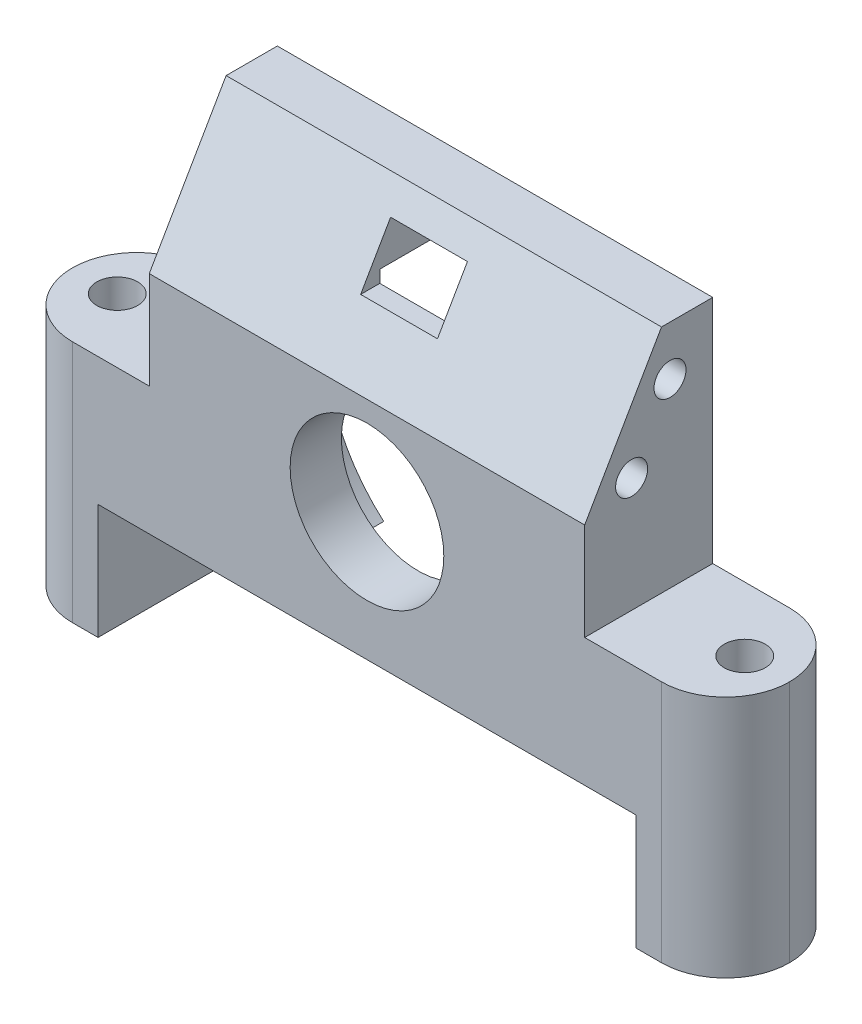
ISO-10303-21;
HEADER;
FILE_DESCRIPTION(('STEP AP214'),'2;1');
FILE_NAME('part.step','',(''),(''),'','','');
FILE_SCHEMA(('AUTOMOTIVE_DESIGN { 1 0 10303 214 1 1 1 1 }'));
ENDSEC;
DATA;
#1=APPLICATION_CONTEXT('core data for automotive mechanical design processes');
#2=APPLICATION_PROTOCOL_DEFINITION('international standard','automotive_design',2000,#1);
#3=PRODUCT_CONTEXT('',#1,'mechanical');
#4=PRODUCT('Part','Part','',(#3));
#5=PRODUCT_RELATED_PRODUCT_CATEGORY('part','',(#4));
#6=PRODUCT_DEFINITION_FORMATION('','',#4);
#7=PRODUCT_DEFINITION_CONTEXT('part definition',#1,'design');
#8=PRODUCT_DEFINITION('design','',#6,#7);
#9=PRODUCT_DEFINITION_SHAPE('','',#8);
#10=(LENGTH_UNIT() NAMED_UNIT(*) SI_UNIT(.MILLI.,.METRE.));
#11=(NAMED_UNIT(*) PLANE_ANGLE_UNIT() SI_UNIT($,.RADIAN.));
#12=(NAMED_UNIT(*) SI_UNIT($,.STERADIAN.) SOLID_ANGLE_UNIT());
#13=UNCERTAINTY_MEASURE_WITH_UNIT(LENGTH_MEASURE(1.E-05),#10,'distance_accuracy_value','');
#14=(GEOMETRIC_REPRESENTATION_CONTEXT(3) GLOBAL_UNCERTAINTY_ASSIGNED_CONTEXT((#13)) GLOBAL_UNIT_ASSIGNED_CONTEXT((#10,
#11,#12)) REPRESENTATION_CONTEXT('',''));
#15=CARTESIAN_POINT('',(0.,0.,0.));
#16=DIRECTION('',(0.,0.,1.));
#17=DIRECTION('',(1.,0.,0.));
#18=AXIS2_PLACEMENT_3D('',#15,#16,#17);
#19=CARTESIAN_POINT('',(0.,0.,6.));
#20=DIRECTION('',(0.,0.,-1.));
#21=DIRECTION('',(-1.,0.,0.));
#22=AXIS2_PLACEMENT_3D('',#19,#20,#21);
#23=CYLINDRICAL_SURFACE('',#22,13.25);
#24=CARTESIAN_POINT('',(0.,0.,6.));
#25=DIRECTION('',(0.,0.,-1.));
#26=DIRECTION('',(-1.,0.,0.));
#27=AXIS2_PLACEMENT_3D('',#24,#25,#26);
#28=CIRCLE('',#27,13.25);
#29=CARTESIAN_POINT('',(3.,12.9059094991403,6.));
#30=VERTEX_POINT('',#29);
#31=CARTESIAN_POINT('',(8.69266932535685,-10.,6.));
#32=VERTEX_POINT('',#31);
#33=EDGE_CURVE('E324',#30,#32,#28,.T.);
#34=ORIENTED_EDGE('',*,*,#33,.F.);
#35=DIRECTION('',(0.,0.,-1.));
#36=VECTOR('',#35,1.);
#37=CARTESIAN_POINT('',(3.,12.9059094991403,6.));
#38=LINE('',#37,#36);
#39=CARTESIAN_POINT('',(3.,12.9059094991403,0.));
#40=VERTEX_POINT('',#39);
#41=EDGE_CURVE('E238',#30,#40,#38,.T.);
#42=ORIENTED_EDGE('',*,*,#41,.T.);
#43=CARTESIAN_POINT('',(0.,0.,0.));
#44=DIRECTION('',(0.,0.,-1.));
#45=DIRECTION('',(-1.,0.,0.));
#46=AXIS2_PLACEMENT_3D('',#43,#44,#45);
#47=CIRCLE('',#46,13.25);
#48=CARTESIAN_POINT('',(8.69266932535685,-10.,0.));
#49=VERTEX_POINT('',#48);
#50=EDGE_CURVE('E319',#40,#49,#47,.T.);
#51=ORIENTED_EDGE('',*,*,#50,.T.);
#52=DIRECTION('',(0.,0.,-1.));
#53=VECTOR('',#52,1.);
#54=CARTESIAN_POINT('',(8.69266932535685,-10.,6.));
#55=LINE('',#54,#53);
#56=EDGE_CURVE('E376',#32,#49,#55,.T.);
#57=ORIENTED_EDGE('',*,*,#56,.F.);
#58=EDGE_LOOP('',(#34,#42,#51,#57));
#59=FACE_BOUND('',#58,.T.);
#60=ADVANCED_FACE('F36',(#59),#23,.F.);
#61=CARTESIAN_POINT('',(17.,18.,10.));
#62=DIRECTION('',(-1.,0.,0.));
#63=DIRECTION('',(0.,0.,1.));
#64=AXIS2_PLACEMENT_3D('',#61,#62,#63);
#65=PLANE('',#64);
#66=CARTESIAN_POINT('',(17.,14.15,3.33604719043193));
#67=DIRECTION('',(-1.,0.,0.));
#68=DIRECTION('',(0.,0.,1.));
#69=AXIS2_PLACEMENT_3D('',#66,#67,#68);
#70=CIRCLE('',#69,1.25);
#71=CARTESIAN_POINT('',(17.,14.15,4.58604719043193));
#72=VERTEX_POINT('',#71);
#73=EDGE_CURVE('E256',#72,#72,#70,.T.);
#74=ORIENTED_EDGE('',*,*,#73,.T.);
#75=EDGE_LOOP('',(#74));
#76=FACE_BOUND('',#75,.T.);
#77=DIRECTION('',(0.,0.,-1.));
#78=VECTOR('',#77,1.);
#79=CARTESIAN_POINT('',(17.,18.,10.));
#80=LINE('',#79,#78);
#81=CARTESIAN_POINT('',(17.,18.,3.99999999999999));
#82=VERTEX_POINT('',#81);
#83=CARTESIAN_POINT('',(17.,18.,0.));
#84=VERTEX_POINT('',#83);
#85=EDGE_CURVE('E363',#82,#84,#80,.T.);
#86=ORIENTED_EDGE('',*,*,#85,.F.);
#87=DIRECTION('',(0.,0.866025403784438,-0.500000000000001));
#88=VECTOR('',#87,1.);
#89=CARTESIAN_POINT('',(17.,7.60769515458674,10.));
#90=LINE('',#89,#88);
#91=CARTESIAN_POINT('',(17.,7.60769515458674,10.));
#92=VERTEX_POINT('',#91);
#93=EDGE_CURVE('E417',#82,#92,#90,.F.);
#94=ORIENTED_EDGE('',*,*,#93,.T.);
#95=DIRECTION('',(0.,1.,0.));
#96=VECTOR('',#95,1.);
#97=CARTESIAN_POINT('',(17.,18.,10.));
#98=LINE('',#97,#96);
#99=CARTESIAN_POINT('',(17.,0.,10.));
#100=VERTEX_POINT('',#99);
#101=EDGE_CURVE('E343',#100,#92,#98,.T.);
#102=ORIENTED_EDGE('',*,*,#101,.F.);
#103=DIRECTION('',(0.,0.,-1.));
#104=VECTOR('',#103,1.);
#105=CARTESIAN_POINT('',(17.,0.,10.));
#106=LINE('',#105,#104);
#107=CARTESIAN_POINT('',(17.,0.,0.));
#108=VERTEX_POINT('',#107);
#109=EDGE_CURVE('E365',#100,#108,#106,.T.);
#110=ORIENTED_EDGE('',*,*,#109,.T.);
#111=DIRECTION('',(0.,1.,0.));
#112=VECTOR('',#111,1.);
#113=CARTESIAN_POINT('',(17.,18.,0.));
#114=LINE('',#113,#112);
#115=EDGE_CURVE('E357',#108,#84,#114,.T.);
#116=ORIENTED_EDGE('',*,*,#115,.T.);
#117=EDGE_LOOP('',(#86,#94,#102,#110,#116));
#118=FACE_BOUND('',#117,.T.);
#119=CARTESIAN_POINT('',(17.,8.96,6.33249508752608));
#120=DIRECTION('',(-1.,0.,0.));
#121=DIRECTION('',(0.,0.,1.));
#122=AXIS2_PLACEMENT_3D('',#119,#120,#121);
#123=CIRCLE('',#122,1.25);
#124=CARTESIAN_POINT('',(17.,8.96,7.58249508752608));
#125=VERTEX_POINT('',#124);
#126=EDGE_CURVE('E253',#125,#125,#123,.T.);
#127=ORIENTED_EDGE('',*,*,#126,.T.);
#128=EDGE_LOOP('',(#127));
#129=FACE_BOUND('',#128,.T.);
#130=ADVANCED_FACE('F480',(#76,#118,#129),#65,.F.);
#131=CARTESIAN_POINT('',(0.,6.53295697895827E-07,10.));
#132=DIRECTION('',(0.,0.,-1.));
#133=DIRECTION('',(-1.,0.,0.));
#134=AXIS2_PLACEMENT_3D('',#131,#132,#133);
#135=CYLINDRICAL_SURFACE('',#134,6.);
#136=CARTESIAN_POINT('',(0.,6.53295697895827E-07,10.));
#137=DIRECTION('',(0.,0.,1.));
#138=DIRECTION('',(1.,0.,0.));
#139=AXIS2_PLACEMENT_3D('',#136,#137,#138);
#140=CIRCLE('',#139,6.);
#141=CARTESIAN_POINT('',(5.99999999999999,6.53295697895827E-07,10.));
#142=VERTEX_POINT('',#141);
#143=EDGE_CURVE('E329',#142,#142,#140,.T.);
#144=ORIENTED_EDGE('',*,*,#143,.T.);
#145=EDGE_LOOP('',(#144));
#146=FACE_BOUND('',#145,.T.);
#147=CARTESIAN_POINT('',(0.,6.53295697895827E-07,6.));
#148=DIRECTION('',(0.,0.,-1.));
#149=DIRECTION('',(-1.,0.,0.));
#150=AXIS2_PLACEMENT_3D('',#147,#148,#149);
#151=CIRCLE('',#150,6.);
#152=CARTESIAN_POINT('',(-6.00000000000001,6.53295697895827E-07,6.));
#153=VERTEX_POINT('',#152);
#154=EDGE_CURVE('E323',#153,#153,#151,.T.);
#155=ORIENTED_EDGE('',*,*,#154,.T.);
#156=EDGE_LOOP('',(#155));
#157=FACE_BOUND('',#156,.T.);
#158=ADVANCED_FACE('F511',(#146,#157),#135,.F.);
#159=CARTESIAN_POINT('',(-17.,18.,10.));
#160=DIRECTION('',(0.,0.,-1.));
#161=DIRECTION('',(-1.,0.,0.));
#162=AXIS2_PLACEMENT_3D('',#159,#160,#161);
#163=PLANE('',#162);
#164=ORIENTED_EDGE('',*,*,#101,.T.);
#165=DIRECTION('',(-1.,0.,0.));
#166=VECTOR('',#165,1.);
#167=CARTESIAN_POINT('',(-17.,7.60769515458674,10.));
#168=LINE('',#167,#166);
#169=CARTESIAN_POINT('',(-17.,7.60769515458675,10.));
#170=VERTEX_POINT('',#169);
#171=EDGE_CURVE('E405',#92,#170,#168,.T.);
#172=ORIENTED_EDGE('',*,*,#171,.T.);
#173=DIRECTION('',(0.,-1.,0.));
#174=VECTOR('',#173,1.);
#175=CARTESIAN_POINT('',(-17.,0.,10.));
#176=LINE('',#175,#174);
#177=CARTESIAN_POINT('',(-17.,0.,10.));
#178=VERTEX_POINT('',#177);
#179=EDGE_CURVE('E333',#170,#178,#176,.T.);
#180=ORIENTED_EDGE('',*,*,#179,.T.);
#181=DIRECTION('',(-1.,0.,0.));
#182=VECTOR('',#181,1.);
#183=CARTESIAN_POINT('',(-17.,0.,10.));
#184=LINE('',#183,#182);
#185=CARTESIAN_POINT('',(-23.,0.,10.));
#186=VERTEX_POINT('',#185);
#187=EDGE_CURVE('E335',#178,#186,#184,.T.);
#188=ORIENTED_EDGE('',*,*,#187,.T.);
#189=DIRECTION('',(0.,-1.,0.));
#190=VECTOR('',#189,1.);
#191=CARTESIAN_POINT('',(-23.,18.,10.));
#192=LINE('',#191,#190);
#193=CARTESIAN_POINT('',(-23.,-19.,10.));
#194=VERTEX_POINT('',#193);
#195=EDGE_CURVE('E379',#186,#194,#192,.T.);
#196=ORIENTED_EDGE('',*,*,#195,.T.);
#197=DIRECTION('',(1.,0.,0.));
#198=VECTOR('',#197,1.);
#199=CARTESIAN_POINT('',(0.,-19.,10.));
#200=LINE('',#199,#198);
#201=CARTESIAN_POINT('',(-21.,-19.,10.));
#202=VERTEX_POINT('',#201);
#203=EDGE_CURVE('E282',#194,#202,#200,.T.);
#204=ORIENTED_EDGE('',*,*,#203,.T.);
#205=DIRECTION('',(0.,1.,0.));
#206=VECTOR('',#205,1.);
#207=CARTESIAN_POINT('',(-21.,-19.,10.));
#208=LINE('',#207,#206);
#209=CARTESIAN_POINT('',(-21.,-10.,10.));
#210=VERTEX_POINT('',#209);
#211=EDGE_CURVE('E293',#202,#210,#208,.T.);
#212=ORIENTED_EDGE('',*,*,#211,.T.);
#213=DIRECTION('',(1.,0.,0.));
#214=VECTOR('',#213,1.);
#215=CARTESIAN_POINT('',(-28.,-10.,10.));
#216=LINE('',#215,#214);
#217=CARTESIAN_POINT('',(21.,-10.,10.));
#218=VERTEX_POINT('',#217);
#219=EDGE_CURVE('E339',#210,#218,#216,.T.);
#220=ORIENTED_EDGE('',*,*,#219,.T.);
#221=DIRECTION('',(0.,1.,0.));
#222=VECTOR('',#221,1.);
#223=CARTESIAN_POINT('',(21.,-19.,10.));
#224=LINE('',#223,#222);
#225=CARTESIAN_POINT('',(21.,-19.,10.));
#226=VERTEX_POINT('',#225);
#227=EDGE_CURVE('E306',#226,#218,#224,.T.);
#228=ORIENTED_EDGE('',*,*,#227,.F.);
#229=DIRECTION('',(1.,0.,0.));
#230=VECTOR('',#229,1.);
#231=CARTESIAN_POINT('',(0.,-19.,10.));
#232=LINE('',#231,#230);
#233=CARTESIAN_POINT('',(23.,-19.,10.));
#234=VERTEX_POINT('',#233);
#235=EDGE_CURVE('E303',#226,#234,#232,.T.);
#236=ORIENTED_EDGE('',*,*,#235,.T.);
#237=DIRECTION('',(0.,1.,0.));
#238=VECTOR('',#237,1.);
#239=CARTESIAN_POINT('',(23.,18.,10.));
#240=LINE('',#239,#238);
#241=CARTESIAN_POINT('',(23.,0.,10.));
#242=VERTEX_POINT('',#241);
#243=EDGE_CURVE('E382',#234,#242,#240,.T.);
#244=ORIENTED_EDGE('',*,*,#243,.T.);
#245=DIRECTION('',(-1.,0.,0.));
#246=VECTOR('',#245,1.);
#247=CARTESIAN_POINT('',(17.,0.,10.));
#248=LINE('',#247,#246);
#249=EDGE_CURVE('E341',#242,#100,#248,.T.);
#250=ORIENTED_EDGE('',*,*,#249,.T.);
#251=EDGE_LOOP('',(#164,#172,#180,#188,#196,#204,#212,#220,#228,#236,#244,#250));
#252=FACE_BOUND('',#251,.T.);
#253=ORIENTED_EDGE('',*,*,#143,.F.);
#254=EDGE_LOOP('',(#253));
#255=FACE_BOUND('',#254,.T.);
#256=ADVANCED_FACE('F850',(#252,#255),#163,.F.);
#257=CARTESIAN_POINT('',(-17.,18.,0.));
#258=DIRECTION('',(0.,0.,-1.));
#259=DIRECTION('',(-1.,0.,0.));
#260=AXIS2_PLACEMENT_3D('',#257,#258,#259);
#261=PLANE('',#260);
#262=DIRECTION('',(0.,-1.,0.));
#263=VECTOR('',#262,1.);
#264=CARTESIAN_POINT('',(3.,16.,0.));
#265=LINE('',#264,#263);
#266=CARTESIAN_POINT('',(3.,16.,0.));
#267=VERTEX_POINT('',#266);
#268=EDGE_CURVE('E213',#267,#40,#265,.T.);
#269=ORIENTED_EDGE('',*,*,#268,.F.);
#270=DIRECTION('',(1.,0.,0.));
#271=VECTOR('',#270,1.);
#272=CARTESIAN_POINT('',(3.,16.,0.));
#273=LINE('',#272,#271);
#274=CARTESIAN_POINT('',(-3.,16.,0.));
#275=VERTEX_POINT('',#274);
#276=EDGE_CURVE('E212',#275,#267,#273,.T.);
#277=ORIENTED_EDGE('',*,*,#276,.F.);
#278=DIRECTION('',(0.,1.,0.));
#279=VECTOR('',#278,1.);
#280=CARTESIAN_POINT('',(-3.,16.,0.));
#281=LINE('',#280,#279);
#282=CARTESIAN_POINT('',(-3.,12.9059094991403,0.));
#283=VERTEX_POINT('',#282);
#284=EDGE_CURVE('E201',#283,#275,#281,.T.);
#285=ORIENTED_EDGE('',*,*,#284,.F.);
#286=CARTESIAN_POINT('',(-8.69266932535685,-10.,0.));
#287=VERTEX_POINT('',#286);
#288=EDGE_CURVE('E325',#287,#283,#47,.T.);
#289=ORIENTED_EDGE('',*,*,#288,.F.);
#290=DIRECTION('',(1.,0.,0.));
#291=VECTOR('',#290,1.);
#292=CARTESIAN_POINT('',(-28.,-10.,0.));
#293=LINE('',#292,#291);
#294=CARTESIAN_POINT('',(-21.,-10.,0.));
#295=VERTEX_POINT('',#294);
#296=EDGE_CURVE('E353',#295,#287,#293,.T.);
#297=ORIENTED_EDGE('',*,*,#296,.F.);
#298=DIRECTION('',(0.,1.,0.));
#299=VECTOR('',#298,1.);
#300=CARTESIAN_POINT('',(-21.,-19.,0.));
#301=LINE('',#300,#299);
#302=CARTESIAN_POINT('',(-21.,-19.,0.));
#303=VERTEX_POINT('',#302);
#304=EDGE_CURVE('E287',#303,#295,#301,.T.);
#305=ORIENTED_EDGE('',*,*,#304,.F.);
#306=DIRECTION('',(1.,0.,0.));
#307=VECTOR('',#306,1.);
#308=CARTESIAN_POINT('',(0.,-19.,0.));
#309=LINE('',#308,#307);
#310=CARTESIAN_POINT('',(-23.,-19.,0.));
#311=VERTEX_POINT('',#310);
#312=EDGE_CURVE('E285',#311,#303,#309,.T.);
#313=ORIENTED_EDGE('',*,*,#312,.F.);
#314=DIRECTION('',(0.,-1.,0.));
#315=VECTOR('',#314,1.);
#316=CARTESIAN_POINT('',(-23.,0.,0.));
#317=LINE('',#316,#315);
#318=CARTESIAN_POINT('',(-23.,0.,0.));
#319=VERTEX_POINT('',#318);
#320=EDGE_CURVE('E393',#311,#319,#317,.F.);
#321=ORIENTED_EDGE('',*,*,#320,.T.);
#322=DIRECTION('',(-1.,0.,0.));
#323=VECTOR('',#322,1.);
#324=CARTESIAN_POINT('',(-17.,0.,0.));
#325=LINE('',#324,#323);
#326=CARTESIAN_POINT('',(-17.,0.,0.));
#327=VERTEX_POINT('',#326);
#328=EDGE_CURVE('E349',#327,#319,#325,.T.);
#329=ORIENTED_EDGE('',*,*,#328,.F.);
#330=DIRECTION('',(0.,-1.,0.));
#331=VECTOR('',#330,1.);
#332=CARTESIAN_POINT('',(-17.,0.,0.));
#333=LINE('',#332,#331);
#334=CARTESIAN_POINT('',(-17.,18.,0.));
#335=VERTEX_POINT('',#334);
#336=EDGE_CURVE('E332',#335,#327,#333,.T.);
#337=ORIENTED_EDGE('',*,*,#336,.F.);
#338=DIRECTION('',(-1.,0.,0.));
#339=VECTOR('',#338,1.);
#340=CARTESIAN_POINT('',(-17.,18.,0.));
#341=LINE('',#340,#339);
#342=EDGE_CURVE('E336',#84,#335,#341,.T.);
#343=ORIENTED_EDGE('',*,*,#342,.F.);
#344=ORIENTED_EDGE('',*,*,#115,.F.);
#345=DIRECTION('',(-1.,0.,0.));
#346=VECTOR('',#345,1.);
#347=CARTESIAN_POINT('',(17.,0.,0.));
#348=LINE('',#347,#346);
#349=CARTESIAN_POINT('',(23.,0.,0.));
#350=VERTEX_POINT('',#349);
#351=EDGE_CURVE('E355',#350,#108,#348,.T.);
#352=ORIENTED_EDGE('',*,*,#351,.F.);
#353=DIRECTION('',(0.,1.,0.));
#354=VECTOR('',#353,1.);
#355=CARTESIAN_POINT('',(23.,-19.,0.));
#356=LINE('',#355,#354);
#357=CARTESIAN_POINT('',(23.,-19.,0.));
#358=VERTEX_POINT('',#357);
#359=EDGE_CURVE('E395',#350,#358,#356,.F.);
#360=ORIENTED_EDGE('',*,*,#359,.T.);
#361=DIRECTION('',(1.,0.,0.));
#362=VECTOR('',#361,1.);
#363=CARTESIAN_POINT('',(0.,-19.,0.));
#364=LINE('',#363,#362);
#365=CARTESIAN_POINT('',(21.,-19.,0.));
#366=VERTEX_POINT('',#365);
#367=EDGE_CURVE('E300',#366,#358,#364,.T.);
#368=ORIENTED_EDGE('',*,*,#367,.F.);
#369=DIRECTION('',(0.,1.,0.));
#370=VECTOR('',#369,1.);
#371=CARTESIAN_POINT('',(21.,-19.,0.));
#372=LINE('',#371,#370);
#373=CARTESIAN_POINT('',(21.,-10.,0.));
#374=VERTEX_POINT('',#373);
#375=EDGE_CURVE('E311',#366,#374,#372,.T.);
#376=ORIENTED_EDGE('',*,*,#375,.T.);
#377=EDGE_CURVE('E352',#49,#374,#293,.T.);
#378=ORIENTED_EDGE('',*,*,#377,.F.);
#379=ORIENTED_EDGE('',*,*,#50,.F.);
#380=EDGE_LOOP('',(#269,#277,#285,#289,#297,#305,#313,#321,#329,#337,#343,#344,#352,#360,#368,
#376,#378,#379));
#381=FACE_BOUND('',#380,.T.);
#382=ADVANCED_FACE('F223',(#381),#261,.T.);
#383=CARTESIAN_POINT('',(-17.,0.,10.));
#384=DIRECTION('',(1.,0.,0.));
#385=DIRECTION('',(0.,0.,-1.));
#386=AXIS2_PLACEMENT_3D('',#383,#384,#385);
#387=PLANE('',#386);
#388=CARTESIAN_POINT('',(-17.,8.96,6.33249508752608));
#389=DIRECTION('',(-1.,0.,0.));
#390=DIRECTION('',(0.,0.,1.));
#391=AXIS2_PLACEMENT_3D('',#388,#389,#390);
#392=CIRCLE('',#391,1.25);
#393=CARTESIAN_POINT('',(-17.,8.96,7.58249508752608));
#394=VERTEX_POINT('',#393);
#395=EDGE_CURVE('E259',#394,#394,#392,.T.);
#396=ORIENTED_EDGE('',*,*,#395,.F.);
#397=EDGE_LOOP('',(#396));
#398=FACE_BOUND('',#397,.T.);
#399=CARTESIAN_POINT('',(-17.,14.15,3.33604719043193));
#400=DIRECTION('',(-1.,0.,0.));
#401=DIRECTION('',(0.,0.,1.));
#402=AXIS2_PLACEMENT_3D('',#399,#400,#401);
#403=CIRCLE('',#402,1.25);
#404=CARTESIAN_POINT('',(-17.,14.15,4.58604719043193));
#405=VERTEX_POINT('',#404);
#406=EDGE_CURVE('E262',#405,#405,#403,.T.);
#407=ORIENTED_EDGE('',*,*,#406,.F.);
#408=EDGE_LOOP('',(#407));
#409=FACE_BOUND('',#408,.T.);
#410=ORIENTED_EDGE('',*,*,#179,.F.);
#411=DIRECTION('',(0.,-0.866025403784438,0.500000000000001));
#412=VECTOR('',#411,1.);
#413=CARTESIAN_POINT('',(-17.,7.60769515458674,10.));
#414=LINE('',#413,#412);
#415=CARTESIAN_POINT('',(-17.,18.,3.99999999999999));
#416=VERTEX_POINT('',#415);
#417=EDGE_CURVE('E413',#170,#416,#414,.F.);
#418=ORIENTED_EDGE('',*,*,#417,.T.);
#419=DIRECTION('',(0.,0.,-1.));
#420=VECTOR('',#419,1.);
#421=CARTESIAN_POINT('',(-17.,18.,10.));
#422=LINE('',#421,#420);
#423=EDGE_CURVE('E346',#416,#335,#422,.T.);
#424=ORIENTED_EDGE('',*,*,#423,.T.);
#425=ORIENTED_EDGE('',*,*,#336,.T.);
#426=DIRECTION('',(0.,0.,-1.));
#427=VECTOR('',#426,1.);
#428=CARTESIAN_POINT('',(-17.,0.,10.));
#429=LINE('',#428,#427);
#430=EDGE_CURVE('E368',#178,#327,#429,.T.);
#431=ORIENTED_EDGE('',*,*,#430,.F.);
#432=EDGE_LOOP('',(#410,#418,#424,#425,#431));
#433=FACE_BOUND('',#432,.T.);
#434=ADVANCED_FACE('F472',(#398,#409,#433),#387,.F.);
#435=CARTESIAN_POINT('',(-17.,0.,10.));
#436=DIRECTION('',(0.,-1.,0.));
#437=DIRECTION('',(1.,0.,0.));
#438=AXIS2_PLACEMENT_3D('',#435,#436,#437);
#439=PLANE('',#438);
#440=CARTESIAN_POINT('',(-24.5,0.,5.));
#441=DIRECTION('',(0.,1.,0.));
#442=DIRECTION('',(0.,0.,1.));
#443=AXIS2_PLACEMENT_3D('',#440,#441,#442);
#444=CIRCLE('',#443,1.6);
#445=CARTESIAN_POINT('',(-24.5,0.,6.6));
#446=VERTEX_POINT('',#445);
#447=EDGE_CURVE('E313',#446,#446,#444,.T.);
#448=ORIENTED_EDGE('',*,*,#447,.F.);
#449=EDGE_LOOP('',(#448));
#450=FACE_BOUND('',#449,.T.);
#451=CARTESIAN_POINT('',(-23.,0.,5.));
#452=DIRECTION('',(0.,-1.,0.));
#453=DIRECTION('',(1.,0.,0.));
#454=AXIS2_PLACEMENT_3D('',#451,#452,#453);
#455=CIRCLE('',#454,5.);
#456=CARTESIAN_POINT('',(-28.,0.,5.));
#457=VERTEX_POINT('',#456);
#458=EDGE_CURVE('E401',#319,#457,#455,.F.);
#459=ORIENTED_EDGE('',*,*,#458,.T.);
#460=CARTESIAN_POINT('',(-23.,0.,5.));
#461=DIRECTION('',(0.,-1.,0.));
#462=DIRECTION('',(1.,0.,0.));
#463=AXIS2_PLACEMENT_3D('',#460,#461,#462);
#464=CIRCLE('',#463,5.);
#465=EDGE_CURVE('E403',#457,#186,#464,.F.);
#466=ORIENTED_EDGE('',*,*,#465,.T.);
#467=ORIENTED_EDGE('',*,*,#187,.F.);
#468=ORIENTED_EDGE('',*,*,#430,.T.);
#469=ORIENTED_EDGE('',*,*,#328,.T.);
#470=EDGE_LOOP('',(#459,#466,#467,#468,#469));
#471=FACE_BOUND('',#470,.T.);
#472=ADVANCED_FACE('F464',(#450,#471),#439,.F.);
#473=CARTESIAN_POINT('',(-28.,-10.,10.));
#474=DIRECTION('',(0.,1.,0.));
#475=DIRECTION('',(0.,0.,1.));
#476=AXIS2_PLACEMENT_3D('',#473,#474,#475);
#477=PLANE('',#476);
#478=ORIENTED_EDGE('',*,*,#219,.F.);
#479=DIRECTION('',(0.,0.,-1.));
#480=VECTOR('',#479,1.);
#481=CARTESIAN_POINT('',(-21.,-10.,-39.3882291506986));
#482=LINE('',#481,#480);
#483=EDGE_CURVE('E283',#210,#295,#482,.T.);
#484=ORIENTED_EDGE('',*,*,#483,.T.);
#485=ORIENTED_EDGE('',*,*,#296,.T.);
#486=DIRECTION('',(0.,0.,-1.));
#487=VECTOR('',#486,1.);
#488=CARTESIAN_POINT('',(-8.69266932535685,-10.,6.));
#489=LINE('',#488,#487);
#490=CARTESIAN_POINT('',(-8.69266932535685,-10.,6.));
#491=VERTEX_POINT('',#490);
#492=EDGE_CURVE('E371',#287,#491,#489,.F.);
#493=ORIENTED_EDGE('',*,*,#492,.T.);
#494=DIRECTION('',(-1.,0.,0.));
#495=VECTOR('',#494,1.);
#496=CARTESIAN_POINT('',(-28.,-10.,6.));
#497=LINE('',#496,#495);
#498=EDGE_CURVE('E327',#32,#491,#497,.T.);
#499=ORIENTED_EDGE('',*,*,#498,.F.);
#500=ORIENTED_EDGE('',*,*,#56,.T.);
#501=ORIENTED_EDGE('',*,*,#377,.T.);
#502=DIRECTION('',(0.,0.,1.));
#503=VECTOR('',#502,1.);
#504=CARTESIAN_POINT('',(21.,-10.,-39.3882291506986));
#505=LINE('',#504,#503);
#506=EDGE_CURVE('E296',#374,#218,#505,.T.);
#507=ORIENTED_EDGE('',*,*,#506,.T.);
#508=EDGE_LOOP('',(#478,#484,#485,#493,#499,#500,#501,#507));
#509=FACE_BOUND('',#508,.T.);
#510=ADVANCED_FACE('F448',(#509),#477,.F.);
#511=CARTESIAN_POINT('',(17.,0.,10.));
#512=DIRECTION('',(0.,-1.,0.));
#513=DIRECTION('',(0.,0.,-1.));
#514=AXIS2_PLACEMENT_3D('',#511,#512,#513);
#515=PLANE('',#514);
#516=CARTESIAN_POINT('',(24.5,0.,5.));
#517=DIRECTION('',(0.,1.,0.));
#518=DIRECTION('',(0.,0.,1.));
#519=AXIS2_PLACEMENT_3D('',#516,#517,#518);
#520=CIRCLE('',#519,1.6);
#521=CARTESIAN_POINT('',(24.5,0.,6.6));
#522=VERTEX_POINT('',#521);
#523=EDGE_CURVE('E316',#522,#522,#520,.T.);
#524=ORIENTED_EDGE('',*,*,#523,.F.);
#525=EDGE_LOOP('',(#524));
#526=FACE_BOUND('',#525,.T.);
#527=ORIENTED_EDGE('',*,*,#249,.F.);
#528=CARTESIAN_POINT('',(23.,0.,5.));
#529=DIRECTION('',(0.,-1.,0.));
#530=DIRECTION('',(0.,0.,-1.));
#531=AXIS2_PLACEMENT_3D('',#528,#529,#530);
#532=CIRCLE('',#531,5.);
#533=CARTESIAN_POINT('',(28.,0.,5.));
#534=VERTEX_POINT('',#533);
#535=EDGE_CURVE('E387',#242,#534,#532,.F.);
#536=ORIENTED_EDGE('',*,*,#535,.T.);
#537=CARTESIAN_POINT('',(23.,0.,5.));
#538=DIRECTION('',(0.,-1.,0.));
#539=DIRECTION('',(0.,0.,-1.));
#540=AXIS2_PLACEMENT_3D('',#537,#538,#539);
#541=CIRCLE('',#540,5.);
#542=EDGE_CURVE('E385',#534,#350,#541,.F.);
#543=ORIENTED_EDGE('',*,*,#542,.T.);
#544=ORIENTED_EDGE('',*,*,#351,.T.);
#545=ORIENTED_EDGE('',*,*,#109,.F.);
#546=EDGE_LOOP('',(#527,#536,#543,#544,#545));
#547=FACE_BOUND('',#546,.T.);
#548=ADVANCED_FACE('F522',(#526,#547),#515,.F.);
#549=CARTESIAN_POINT('',(-17.,18.,10.));
#550=DIRECTION('',(0.,-1.,0.));
#551=DIRECTION('',(0.,0.,-1.));
#552=AXIS2_PLACEMENT_3D('',#549,#550,#551);
#553=PLANE('',#552);
#554=ORIENTED_EDGE('',*,*,#423,.F.);
#555=DIRECTION('',(1.,0.,0.));
#556=VECTOR('',#555,1.);
#557=CARTESIAN_POINT('',(-17.,18.,3.99999999999999));
#558=LINE('',#557,#556);
#559=EDGE_CURVE('E415',#416,#82,#558,.T.);
#560=ORIENTED_EDGE('',*,*,#559,.T.);
#561=ORIENTED_EDGE('',*,*,#85,.T.);
#562=ORIENTED_EDGE('',*,*,#342,.T.);
#563=EDGE_LOOP('',(#554,#560,#561,#562));
#564=FACE_BOUND('',#563,.T.);
#565=ADVANCED_FACE('F476',(#564),#553,.F.);
#566=ORIENTED_EDGE('',*,*,#288,.T.);
#567=DIRECTION('',(0.,0.,-1.));
#568=VECTOR('',#567,1.);
#569=CARTESIAN_POINT('',(-3.,12.9059094991403,6.));
#570=LINE('',#569,#568);
#571=CARTESIAN_POINT('',(-3.,12.9059094991403,6.));
#572=VERTEX_POINT('',#571);
#573=EDGE_CURVE('E207',#283,#572,#570,.F.);
#574=ORIENTED_EDGE('',*,*,#573,.T.);
#575=EDGE_CURVE('E320',#491,#572,#28,.T.);
#576=ORIENTED_EDGE('',*,*,#575,.F.);
#577=ORIENTED_EDGE('',*,*,#492,.F.);
#578=EDGE_LOOP('',(#566,#574,#576,#577));
#579=FACE_BOUND('',#578,.T.);
#580=ADVANCED_FACE('F442',(#579),#23,.F.);
#581=CARTESIAN_POINT('',(0.,0.,6.));
#582=DIRECTION('',(0.,0.,-1.));
#583=DIRECTION('',(-1.,0.,0.));
#584=AXIS2_PLACEMENT_3D('',#581,#582,#583);
#585=PLANE('',#584);
#586=DIRECTION('',(0.,-1.,0.));
#587=VECTOR('',#586,1.);
#588=CARTESIAN_POINT('',(3.,0.,6.));
#589=LINE('',#588,#587);
#590=CARTESIAN_POINT('',(3.,11.9470597491027,6.));
#591=VERTEX_POINT('',#590);
#592=EDGE_CURVE('E236',#30,#591,#589,.T.);
#593=ORIENTED_EDGE('',*,*,#592,.F.);
#594=ORIENTED_EDGE('',*,*,#33,.T.);
#595=ORIENTED_EDGE('',*,*,#498,.T.);
#596=ORIENTED_EDGE('',*,*,#575,.T.);
#597=DIRECTION('',(0.,1.,0.));
#598=VECTOR('',#597,1.);
#599=CARTESIAN_POINT('',(-3.,0.,6.));
#600=LINE('',#599,#598);
#601=CARTESIAN_POINT('',(-3.,11.9470597491027,6.));
#602=VERTEX_POINT('',#601);
#603=EDGE_CURVE('E233',#602,#572,#600,.T.);
#604=ORIENTED_EDGE('',*,*,#603,.F.);
#605=DIRECTION('',(-1.,0.,0.));
#606=VECTOR('',#605,1.);
#607=CARTESIAN_POINT('',(0.,11.9470597491027,6.));
#608=LINE('',#607,#606);
#609=EDGE_CURVE('E229',#591,#602,#608,.T.);
#610=ORIENTED_EDGE('',*,*,#609,.F.);
#611=EDGE_LOOP('',(#593,#594,#595,#596,#604,#610));
#612=FACE_BOUND('',#611,.T.);
#613=ORIENTED_EDGE('',*,*,#154,.F.);
#614=EDGE_LOOP('',(#613));
#615=FACE_BOUND('',#614,.T.);
#616=ADVANCED_FACE('F438',(#612,#615),#585,.T.);
#617=CARTESIAN_POINT('',(24.5,-14.5254833995939,5.));
#618=DIRECTION('',(0.,1.,0.));
#619=DIRECTION('',(0.,0.,1.));
#620=AXIS2_PLACEMENT_3D('',#617,#618,#619);
#621=CYLINDRICAL_SURFACE('',#620,1.6);
#622=CARTESIAN_POINT('',(24.5,-8.86995696904863,5.));
#623=DIRECTION('',(0.,-1.,0.));
#624=DIRECTION('',(0.,0.,-1.));
#625=AXIS2_PLACEMENT_3D('',#622,#623,#624);
#626=CIRCLE('',#625,1.6);
#627=CARTESIAN_POINT('',(24.5,-8.86995696904863,3.4));
#628=VERTEX_POINT('',#627);
#629=EDGE_CURVE('E278',#628,#628,#626,.T.);
#630=ORIENTED_EDGE('',*,*,#629,.T.);
#631=EDGE_LOOP('',(#630));
#632=FACE_BOUND('',#631,.T.);
#633=ORIENTED_EDGE('',*,*,#523,.T.);
#634=EDGE_LOOP('',(#633));
#635=FACE_BOUND('',#634,.T.);
#636=ADVANCED_FACE('F521',(#632,#635),#621,.F.);
#637=CARTESIAN_POINT('',(-24.5,-14.5254833995939,5.));
#638=DIRECTION('',(0.,1.,0.));
#639=DIRECTION('',(0.,0.,1.));
#640=AXIS2_PLACEMENT_3D('',#637,#638,#639);
#641=CYLINDRICAL_SURFACE('',#640,1.6);
#642=CARTESIAN_POINT('',(-24.5,-8.86995696904863,5.));
#643=DIRECTION('',(0.,-1.,0.));
#644=DIRECTION('',(0.,0.,-1.));
#645=AXIS2_PLACEMENT_3D('',#642,#643,#644);
#646=CIRCLE('',#645,1.6);
#647=CARTESIAN_POINT('',(-24.5,-8.86995696904863,3.4));
#648=VERTEX_POINT('',#647);
#649=EDGE_CURVE('E271',#648,#648,#646,.T.);
#650=ORIENTED_EDGE('',*,*,#649,.T.);
#651=EDGE_LOOP('',(#650));
#652=FACE_BOUND('',#651,.T.);
#653=ORIENTED_EDGE('',*,*,#447,.T.);
#654=EDGE_LOOP('',(#653));
#655=FACE_BOUND('',#654,.T.);
#656=ADVANCED_FACE('F820',(#652,#655),#641,.F.);
#657=CARTESIAN_POINT('',(21.,-19.,-39.3882291506986));
#658=DIRECTION('',(-1.,0.,0.));
#659=DIRECTION('',(0.,0.,1.));
#660=AXIS2_PLACEMENT_3D('',#657,#658,#659);
#661=PLANE('',#660);
#662=ORIENTED_EDGE('',*,*,#506,.F.);
#663=ORIENTED_EDGE('',*,*,#375,.F.);
#664=DIRECTION('',(0.,0.,1.));
#665=VECTOR('',#664,1.);
#666=CARTESIAN_POINT('',(21.,-19.,-39.3882291506986));
#667=LINE('',#666,#665);
#668=EDGE_CURVE('E297',#366,#226,#667,.T.);
#669=ORIENTED_EDGE('',*,*,#668,.T.);
#670=ORIENTED_EDGE('',*,*,#227,.T.);
#671=EDGE_LOOP('',(#662,#663,#669,#670));
#672=FACE_BOUND('',#671,.T.);
#673=ADVANCED_FACE('F502',(#672),#661,.T.);
#674=CARTESIAN_POINT('',(0.,-19.,-39.3882291506986));
#675=DIRECTION('',(0.,-1.,0.));
#676=DIRECTION('',(0.,0.,-1.));
#677=AXIS2_PLACEMENT_3D('',#674,#675,#676);
#678=PLANE('',#677);
#679=CARTESIAN_POINT('',(24.5,-19.,5.));
#680=DIRECTION('',(0.,-1.,0.));
#681=DIRECTION('',(0.,0.,-1.));
#682=AXIS2_PLACEMENT_3D('',#679,#680,#681);
#683=CIRCLE('',#682,1.65);
#684=CARTESIAN_POINT('',(24.5,-19.,3.35));
#685=VERTEX_POINT('',#684);
#686=EDGE_CURVE('E272',#685,#685,#683,.T.);
#687=ORIENTED_EDGE('',*,*,#686,.F.);
#688=EDGE_LOOP('',(#687));
#689=FACE_BOUND('',#688,.T.);
#690=CARTESIAN_POINT('',(23.,-19.,5.));
#691=DIRECTION('',(0.,-1.,0.));
#692=DIRECTION('',(0.,0.,-1.));
#693=AXIS2_PLACEMENT_3D('',#690,#691,#692);
#694=CIRCLE('',#693,5.);
#695=CARTESIAN_POINT('',(28.,-19.,5.));
#696=VERTEX_POINT('',#695);
#697=EDGE_CURVE('E389',#358,#696,#694,.T.);
#698=ORIENTED_EDGE('',*,*,#697,.T.);
#699=CARTESIAN_POINT('',(23.,-19.,5.));
#700=DIRECTION('',(0.,-1.,0.));
#701=DIRECTION('',(0.,0.,-1.));
#702=AXIS2_PLACEMENT_3D('',#699,#700,#701);
#703=CIRCLE('',#702,5.);
#704=EDGE_CURVE('E391',#696,#234,#703,.T.);
#705=ORIENTED_EDGE('',*,*,#704,.T.);
#706=ORIENTED_EDGE('',*,*,#235,.F.);
#707=ORIENTED_EDGE('',*,*,#668,.F.);
#708=ORIENTED_EDGE('',*,*,#367,.T.);
#709=EDGE_LOOP('',(#698,#705,#706,#707,#708));
#710=FACE_BOUND('',#709,.T.);
#711=ADVANCED_FACE('F495',(#689,#710),#678,.T.);
#712=CARTESIAN_POINT('',(-21.,-19.,-39.3882291506986));
#713=DIRECTION('',(1.,0.,0.));
#714=DIRECTION('',(0.,0.,-1.));
#715=AXIS2_PLACEMENT_3D('',#712,#713,#714);
#716=PLANE('',#715);
#717=ORIENTED_EDGE('',*,*,#483,.F.);
#718=ORIENTED_EDGE('',*,*,#211,.F.);
#719=DIRECTION('',(0.,0.,-1.));
#720=VECTOR('',#719,1.);
#721=CARTESIAN_POINT('',(-21.,-19.,-39.3882291506986));
#722=LINE('',#721,#720);
#723=EDGE_CURVE('E279',#202,#303,#722,.T.);
#724=ORIENTED_EDGE('',*,*,#723,.T.);
#725=ORIENTED_EDGE('',*,*,#304,.T.);
#726=EDGE_LOOP('',(#717,#718,#724,#725));
#727=FACE_BOUND('',#726,.T.);
#728=ADVANCED_FACE('F451',(#727),#716,.T.);
#729=CARTESIAN_POINT('',(0.,-19.,-39.3882291506986));
#730=DIRECTION('',(0.,-1.,0.));
#731=DIRECTION('',(0.,0.,-1.));
#732=AXIS2_PLACEMENT_3D('',#729,#730,#731);
#733=PLANE('',#732);
#734=CARTESIAN_POINT('',(-24.5,-19.,5.));
#735=DIRECTION('',(0.,-1.,0.));
#736=DIRECTION('',(0.,0.,-1.));
#737=AXIS2_PLACEMENT_3D('',#734,#735,#736);
#738=CIRCLE('',#737,1.65);
#739=CARTESIAN_POINT('',(-24.5,-19.,3.35));
#740=VERTEX_POINT('',#739);
#741=EDGE_CURVE('E265',#740,#740,#738,.T.);
#742=ORIENTED_EDGE('',*,*,#741,.F.);
#743=EDGE_LOOP('',(#742));
#744=FACE_BOUND('',#743,.T.);
#745=ORIENTED_EDGE('',*,*,#203,.F.);
#746=CARTESIAN_POINT('',(-23.,-19.,5.));
#747=DIRECTION('',(0.,-1.,0.));
#748=DIRECTION('',(0.,0.,-1.));
#749=AXIS2_PLACEMENT_3D('',#746,#747,#748);
#750=CIRCLE('',#749,5.);
#751=CARTESIAN_POINT('',(-28.,-19.,5.));
#752=VERTEX_POINT('',#751);
#753=EDGE_CURVE('E399',#194,#752,#750,.T.);
#754=ORIENTED_EDGE('',*,*,#753,.T.);
#755=CARTESIAN_POINT('',(-23.,-19.,5.));
#756=DIRECTION('',(0.,-1.,0.));
#757=DIRECTION('',(0.,0.,-1.));
#758=AXIS2_PLACEMENT_3D('',#755,#756,#757);
#759=CIRCLE('',#758,5.);
#760=EDGE_CURVE('E397',#752,#311,#759,.T.);
#761=ORIENTED_EDGE('',*,*,#760,.T.);
#762=ORIENTED_EDGE('',*,*,#312,.T.);
#763=ORIENTED_EDGE('',*,*,#723,.F.);
#764=EDGE_LOOP('',(#745,#754,#761,#762,#763));
#765=FACE_BOUND('',#764,.T.);
#766=ADVANCED_FACE('F455',(#744,#765),#733,.T.);
#767=CARTESIAN_POINT('',(23.,0.,5.));
#768=DIRECTION('',(0.,-1.,0.));
#769=DIRECTION('',(0.,0.,-1.));
#770=AXIS2_PLACEMENT_3D('',#767,#768,#769);
#771=CYLINDRICAL_SURFACE('',#770,5.);
#772=DIRECTION('',(0.,1.,0.));
#773=VECTOR('',#772,1.);
#774=CARTESIAN_POINT('',(28.,0.,5.));
#775=LINE('',#774,#773);
#776=EDGE_CURVE('E290',#696,#534,#775,.T.);
#777=ORIENTED_EDGE('',*,*,#776,.F.);
#778=ORIENTED_EDGE('',*,*,#697,.F.);
#779=ORIENTED_EDGE('',*,*,#359,.F.);
#780=ORIENTED_EDGE('',*,*,#542,.F.);
#781=EDGE_LOOP('',(#777,#778,#779,#780));
#782=FACE_BOUND('',#781,.T.);
#783=ADVANCED_FACE('F492',(#782),#771,.T.);
#784=CARTESIAN_POINT('',(23.,18.,5.));
#785=DIRECTION('',(0.,1.,0.));
#786=DIRECTION('',(0.,0.,1.));
#787=AXIS2_PLACEMENT_3D('',#784,#785,#786);
#788=CYLINDRICAL_SURFACE('',#787,5.);
#789=ORIENTED_EDGE('',*,*,#704,.F.);
#790=ORIENTED_EDGE('',*,*,#776,.T.);
#791=ORIENTED_EDGE('',*,*,#535,.F.);
#792=ORIENTED_EDGE('',*,*,#243,.F.);
#793=EDGE_LOOP('',(#789,#790,#791,#792));
#794=FACE_BOUND('',#793,.T.);
#795=ADVANCED_FACE('F540',(#794),#788,.T.);
#796=CARTESIAN_POINT('',(-23.,0.,5.));
#797=DIRECTION('',(0.,1.,0.));
#798=DIRECTION('',(0.,0.,1.));
#799=AXIS2_PLACEMENT_3D('',#796,#797,#798);
#800=CYLINDRICAL_SURFACE('',#799,5.);
#801=DIRECTION('',(0.,-1.,0.));
#802=VECTOR('',#801,1.);
#803=CARTESIAN_POINT('',(-28.,-19.,5.));
#804=LINE('',#803,#802);
#805=EDGE_CURVE('E408',#457,#752,#804,.T.);
#806=ORIENTED_EDGE('',*,*,#805,.F.);
#807=ORIENTED_EDGE('',*,*,#458,.F.);
#808=ORIENTED_EDGE('',*,*,#320,.F.);
#809=ORIENTED_EDGE('',*,*,#760,.F.);
#810=EDGE_LOOP('',(#806,#807,#808,#809));
#811=FACE_BOUND('',#810,.T.);
#812=ADVANCED_FACE('F461',(#811),#800,.T.);
#813=CARTESIAN_POINT('',(-23.,18.,5.));
#814=DIRECTION('',(0.,-1.,0.));
#815=DIRECTION('',(0.,0.,-1.));
#816=AXIS2_PLACEMENT_3D('',#813,#814,#815);
#817=CYLINDRICAL_SURFACE('',#816,5.);
#818=ORIENTED_EDGE('',*,*,#465,.F.);
#819=ORIENTED_EDGE('',*,*,#805,.T.);
#820=ORIENTED_EDGE('',*,*,#753,.F.);
#821=ORIENTED_EDGE('',*,*,#195,.F.);
#822=EDGE_LOOP('',(#818,#819,#820,#821));
#823=FACE_BOUND('',#822,.T.);
#824=ADVANCED_FACE('F546',(#823),#817,.T.);
#825=CARTESIAN_POINT('',(-17.,7.60769515458674,10.));
#826=DIRECTION('',(0.,-0.500000000000001,-0.866025403784438));
#827=DIRECTION('',(0.,0.866025403784438,-0.500000000000001));
#828=AXIS2_PLACEMENT_3D('',#825,#826,#827);
#829=PLANE('',#828);
#830=DIRECTION('',(0.,-0.866025403784438,0.500000000000001));
#831=VECTOR('',#830,1.);
#832=CARTESIAN_POINT('',(3.,7.60769515458674,10.));
#833=LINE('',#832,#831);
#834=CARTESIAN_POINT('',(3.,11.9470597491027,7.4946666832443));
#835=VERTEX_POINT('',#834);
#836=CARTESIAN_POINT('',(3.,16.,5.15470053837924));
#837=VERTEX_POINT('',#836);
#838=EDGE_CURVE('E11',#835,#837,#833,.F.);
#839=ORIENTED_EDGE('',*,*,#838,.F.);
#840=DIRECTION('',(-1.,0.,0.));
#841=VECTOR('',#840,1.);
#842=CARTESIAN_POINT('',(-17.,11.9470597491027,7.4946666832443));
#843=LINE('',#842,#841);
#844=CARTESIAN_POINT('',(-3.,11.9470597491027,7.4946666832443));
#845=VERTEX_POINT('',#844);
#846=EDGE_CURVE('E419',#845,#835,#843,.F.);
#847=ORIENTED_EDGE('',*,*,#846,.F.);
#848=DIRECTION('',(0.,0.866025403784438,-0.500000000000001));
#849=VECTOR('',#848,1.);
#850=CARTESIAN_POINT('',(-3.,7.60769515458674,10.));
#851=LINE('',#850,#849);
#852=CARTESIAN_POINT('',(-3.,16.,5.15470053837924));
#853=VERTEX_POINT('',#852);
#854=EDGE_CURVE('E425',#853,#845,#851,.F.);
#855=ORIENTED_EDGE('',*,*,#854,.F.);
#856=DIRECTION('',(1.,0.,0.));
#857=VECTOR('',#856,1.);
#858=CARTESIAN_POINT('',(-17.,16.,5.15470053837924));
#859=LINE('',#858,#857);
#860=EDGE_CURVE('E44',#837,#853,#859,.F.);
#861=ORIENTED_EDGE('',*,*,#860,.F.);
#862=EDGE_LOOP('',(#839,#847,#855,#861));
#863=FACE_BOUND('',#862,.T.);
#864=ORIENTED_EDGE('',*,*,#93,.F.);
#865=ORIENTED_EDGE('',*,*,#559,.F.);
#866=ORIENTED_EDGE('',*,*,#417,.F.);
#867=ORIENTED_EDGE('',*,*,#171,.F.);
#868=EDGE_LOOP('',(#864,#865,#866,#867));
#869=FACE_BOUND('',#868,.T.);
#870=ADVANCED_FACE('F38',(#863,#869),#829,.F.);
#871=CARTESIAN_POINT('',(24.5,-8.9,5.));
#872=DIRECTION('',(0.,-1.,0.));
#873=DIRECTION('',(0.,0.,-1.));
#874=AXIS2_PLACEMENT_3D('',#871,#872,#873);
#875=CONICAL_SURFACE('',#874,1.65,1.02974425867665);
#876=CARTESIAN_POINT('',(24.5,-8.9,5.));
#877=DIRECTION('',(0.,-1.,0.));
#878=DIRECTION('',(0.,0.,-1.));
#879=AXIS2_PLACEMENT_3D('',#876,#877,#878);
#880=CIRCLE('',#879,1.65);
#881=CARTESIAN_POINT('',(24.5,-8.9,3.35));
#882=VERTEX_POINT('',#881);
#883=EDGE_CURVE('E275',#882,#882,#880,.T.);
#884=ORIENTED_EDGE('',*,*,#883,.T.);
#885=EDGE_LOOP('',(#884));
#886=FACE_BOUND('',#885,.T.);
#887=ORIENTED_EDGE('',*,*,#629,.F.);
#888=EDGE_LOOP('',(#887));
#889=FACE_BOUND('',#888,.T.);
#890=ADVANCED_FACE('F565',(#886,#889),#875,.F.);
#891=CARTESIAN_POINT('',(24.5,-19.,5.));
#892=DIRECTION('',(0.,-1.,0.));
#893=DIRECTION('',(0.,0.,-1.));
#894=AXIS2_PLACEMENT_3D('',#891,#892,#893);
#895=CYLINDRICAL_SURFACE('',#894,1.65);
#896=ORIENTED_EDGE('',*,*,#883,.F.);
#897=EDGE_LOOP('',(#896));
#898=FACE_BOUND('',#897,.T.);
#899=ORIENTED_EDGE('',*,*,#686,.T.);
#900=EDGE_LOOP('',(#899));
#901=FACE_BOUND('',#900,.T.);
#902=ADVANCED_FACE('F573',(#898,#901),#895,.F.);
#903=CARTESIAN_POINT('',(-24.5,-8.9,5.));
#904=DIRECTION('',(0.,-1.,0.));
#905=DIRECTION('',(0.,0.,-1.));
#906=AXIS2_PLACEMENT_3D('',#903,#904,#905);
#907=CONICAL_SURFACE('',#906,1.65,1.02974425867665);
#908=CARTESIAN_POINT('',(-24.5,-8.9,5.));
#909=DIRECTION('',(0.,-1.,0.));
#910=DIRECTION('',(0.,0.,-1.));
#911=AXIS2_PLACEMENT_3D('',#908,#909,#910);
#912=CIRCLE('',#911,1.65);
#913=CARTESIAN_POINT('',(-24.5,-8.9,3.35));
#914=VERTEX_POINT('',#913);
#915=EDGE_CURVE('E268',#914,#914,#912,.T.);
#916=ORIENTED_EDGE('',*,*,#915,.T.);
#917=EDGE_LOOP('',(#916));
#918=FACE_BOUND('',#917,.T.);
#919=ORIENTED_EDGE('',*,*,#649,.F.);
#920=EDGE_LOOP('',(#919));
#921=FACE_BOUND('',#920,.T.);
#922=ADVANCED_FACE('F583',(#918,#921),#907,.F.);
#923=CARTESIAN_POINT('',(-24.5,-19.,5.));
#924=DIRECTION('',(0.,-1.,0.));
#925=DIRECTION('',(0.,0.,-1.));
#926=AXIS2_PLACEMENT_3D('',#923,#924,#925);
#927=CYLINDRICAL_SURFACE('',#926,1.65);
#928=ORIENTED_EDGE('',*,*,#915,.F.);
#929=EDGE_LOOP('',(#928));
#930=FACE_BOUND('',#929,.T.);
#931=ORIENTED_EDGE('',*,*,#741,.T.);
#932=EDGE_LOOP('',(#931));
#933=FACE_BOUND('',#932,.T.);
#934=ADVANCED_FACE('F592',(#930,#933),#927,.F.);
#935=CARTESIAN_POINT('',(-13.,14.15,3.33604719043193));
#936=DIRECTION('',(-1.,0.,0.));
#937=DIRECTION('',(0.,0.,1.));
#938=AXIS2_PLACEMENT_3D('',#935,#936,#937);
#939=CYLINDRICAL_SURFACE('',#938,1.25);
#940=ORIENTED_EDGE('',*,*,#406,.T.);
#941=EDGE_LOOP('',(#940));
#942=FACE_BOUND('',#941,.T.);
#943=CARTESIAN_POINT('',(-12.5,14.15,3.33604719043193));
#944=DIRECTION('',(-1.,0.,0.));
#945=DIRECTION('',(0.,0.,1.));
#946=AXIS2_PLACEMENT_3D('',#943,#944,#945);
#947=CIRCLE('',#946,1.25);
#948=CARTESIAN_POINT('',(-12.5,14.15,4.58604719043193));
#949=VERTEX_POINT('',#948);
#950=EDGE_CURVE('E244',#949,#949,#947,.T.);
#951=ORIENTED_EDGE('',*,*,#950,.F.);
#952=EDGE_LOOP('',(#951));
#953=FACE_BOUND('',#952,.T.);
#954=ADVANCED_FACE('F600',(#942,#953),#939,.F.);
#955=CARTESIAN_POINT('',(-13.,8.96,6.33249508752608));
#956=DIRECTION('',(-1.,0.,0.));
#957=DIRECTION('',(0.,0.,1.));
#958=AXIS2_PLACEMENT_3D('',#955,#956,#957);
#959=CYLINDRICAL_SURFACE('',#958,1.25);
#960=ORIENTED_EDGE('',*,*,#395,.T.);
#961=EDGE_LOOP('',(#960));
#962=FACE_BOUND('',#961,.T.);
#963=CARTESIAN_POINT('',(-12.5,8.96,6.33249508752608));
#964=DIRECTION('',(-1.,0.,0.));
#965=DIRECTION('',(0.,0.,1.));
#966=AXIS2_PLACEMENT_3D('',#963,#964,#965);
#967=CIRCLE('',#966,1.25);
#968=CARTESIAN_POINT('',(-12.5,8.96,7.58249508752608));
#969=VERTEX_POINT('',#968);
#970=EDGE_CURVE('E241',#969,#969,#967,.T.);
#971=ORIENTED_EDGE('',*,*,#970,.F.);
#972=EDGE_LOOP('',(#971));
#973=FACE_BOUND('',#972,.T.);
#974=ADVANCED_FACE('F608',(#962,#973),#959,.F.);
#975=CARTESIAN_POINT('',(13.,14.15,3.33604719043193));
#976=DIRECTION('',(1.,0.,0.));
#977=DIRECTION('',(0.,0.,-1.));
#978=AXIS2_PLACEMENT_3D('',#975,#976,#977);
#979=CYLINDRICAL_SURFACE('',#978,1.25);
#980=ORIENTED_EDGE('',*,*,#73,.F.);
#981=EDGE_LOOP('',(#980));
#982=FACE_BOUND('',#981,.T.);
#983=CARTESIAN_POINT('',(12.5,14.15,3.33604719043193));
#984=DIRECTION('',(1.,0.,0.));
#985=DIRECTION('',(0.,0.,-1.));
#986=AXIS2_PLACEMENT_3D('',#983,#984,#985);
#987=CIRCLE('',#986,1.25);
#988=CARTESIAN_POINT('',(12.5,14.15,2.08604719043193));
#989=VERTEX_POINT('',#988);
#990=EDGE_CURVE('E250',#989,#989,#987,.T.);
#991=ORIENTED_EDGE('',*,*,#990,.F.);
#992=EDGE_LOOP('',(#991));
#993=FACE_BOUND('',#992,.T.);
#994=ADVANCED_FACE('F617',(#982,#993),#979,.F.);
#995=CARTESIAN_POINT('',(13.,8.96,6.33249508752608));
#996=DIRECTION('',(1.,0.,0.));
#997=DIRECTION('',(0.,0.,-1.));
#998=AXIS2_PLACEMENT_3D('',#995,#996,#997);
#999=CYLINDRICAL_SURFACE('',#998,1.25);
#1000=ORIENTED_EDGE('',*,*,#126,.F.);
#1001=EDGE_LOOP('',(#1000));
#1002=FACE_BOUND('',#1001,.T.);
#1003=CARTESIAN_POINT('',(12.5,8.96,6.33249508752608));
#1004=DIRECTION('',(1.,0.,0.));
#1005=DIRECTION('',(0.,0.,-1.));
#1006=AXIS2_PLACEMENT_3D('',#1003,#1004,#1005);
#1007=CIRCLE('',#1006,1.25);
#1008=CARTESIAN_POINT('',(12.5,8.96,5.08249508752608));
#1009=VERTEX_POINT('',#1008);
#1010=EDGE_CURVE('E247',#1009,#1009,#1007,.T.);
#1011=ORIENTED_EDGE('',*,*,#1010,.F.);
#1012=EDGE_LOOP('',(#1011));
#1013=FACE_BOUND('',#1012,.T.);
#1014=ADVANCED_FACE('F625',(#1002,#1013),#999,.F.);
#1015=CARTESIAN_POINT('',(12.5,14.15,3.33604719043193));
#1016=DIRECTION('',(1.,0.,0.));
#1017=DIRECTION('',(0.,0.,-1.));
#1018=AXIS2_PLACEMENT_3D('',#1015,#1016,#1017);
#1019=CONICAL_SURFACE('',#1018,1.25,1.02974425867665);
#1020=CARTESIAN_POINT('',(11.7489242262155,14.15,3.33604719043193));
#1021=VERTEX_POINT('',#1020);
#1022=VERTEX_LOOP('',#1021);
#1023=FACE_BOUND('',#1022,.T.);
#1024=ORIENTED_EDGE('',*,*,#990,.T.);
#1025=EDGE_LOOP('',(#1024));
#1026=FACE_BOUND('',#1025,.T.);
#1027=ADVANCED_FACE('F632',(#1023,#1026),#1019,.F.);
#1028=CARTESIAN_POINT('',(12.5,8.96,6.33249508752608));
#1029=DIRECTION('',(1.,0.,0.));
#1030=DIRECTION('',(0.,0.,-1.));
#1031=AXIS2_PLACEMENT_3D('',#1028,#1029,#1030);
#1032=CONICAL_SURFACE('',#1031,1.25,1.02974425867665);
#1033=CARTESIAN_POINT('',(11.7489242262155,8.96,6.33249508752608));
#1034=VERTEX_POINT('',#1033);
#1035=VERTEX_LOOP('',#1034);
#1036=FACE_BOUND('',#1035,.T.);
#1037=ORIENTED_EDGE('',*,*,#1010,.T.);
#1038=EDGE_LOOP('',(#1037));
#1039=FACE_BOUND('',#1038,.T.);
#1040=ADVANCED_FACE('F640',(#1036,#1039),#1032,.F.);
#1041=CARTESIAN_POINT('',(-12.5,14.15,3.33604719043193));
#1042=DIRECTION('',(-1.,0.,0.));
#1043=DIRECTION('',(0.,0.,1.));
#1044=AXIS2_PLACEMENT_3D('',#1041,#1042,#1043);
#1045=CONICAL_SURFACE('',#1044,1.25,1.02974425867665);
#1046=CARTESIAN_POINT('',(-11.7489242262155,14.15,3.33604719043193));
#1047=VERTEX_POINT('',#1046);
#1048=VERTEX_LOOP('',#1047);
#1049=FACE_BOUND('',#1048,.T.);
#1050=ORIENTED_EDGE('',*,*,#950,.T.);
#1051=EDGE_LOOP('',(#1050));
#1052=FACE_BOUND('',#1051,.T.);
#1053=ADVANCED_FACE('F649',(#1049,#1052),#1045,.F.);
#1054=CARTESIAN_POINT('',(-12.5,8.96,6.33249508752608));
#1055=DIRECTION('',(-1.,0.,0.));
#1056=DIRECTION('',(0.,0.,1.));
#1057=AXIS2_PLACEMENT_3D('',#1054,#1055,#1056);
#1058=CONICAL_SURFACE('',#1057,1.25,1.02974425867665);
#1059=CARTESIAN_POINT('',(-11.7489242262155,8.96,6.33249508752608));
#1060=VERTEX_POINT('',#1059);
#1061=VERTEX_LOOP('',#1060);
#1062=FACE_BOUND('',#1061,.T.);
#1063=ORIENTED_EDGE('',*,*,#970,.T.);
#1064=EDGE_LOOP('',(#1063));
#1065=FACE_BOUND('',#1064,.T.);
#1066=ADVANCED_FACE('F657',(#1062,#1065),#1058,.F.);
#1067=CARTESIAN_POINT('',(3.,16.,17.2406025078956));
#1068=DIRECTION('',(1.,0.,0.));
#1069=DIRECTION('',(0.,1.,0.));
#1070=AXIS2_PLACEMENT_3D('',#1067,#1068,#1069);
#1071=PLANE('',#1070);
#1072=ORIENTED_EDGE('',*,*,#592,.T.);
#1073=DIRECTION('',(0.,0.,-1.));
#1074=VECTOR('',#1073,1.);
#1075=CARTESIAN_POINT('',(3.,11.9470597491027,17.2406025078956));
#1076=LINE('',#1075,#1074);
#1077=EDGE_CURVE('E51',#835,#591,#1076,.T.);
#1078=ORIENTED_EDGE('',*,*,#1077,.F.);
#1079=ORIENTED_EDGE('',*,*,#838,.T.);
#1080=DIRECTION('',(0.,0.,-1.));
#1081=VECTOR('',#1080,1.);
#1082=CARTESIAN_POINT('',(3.,16.,17.2406025078956));
#1083=LINE('',#1082,#1081);
#1084=EDGE_CURVE('E221',#837,#267,#1083,.T.);
#1085=ORIENTED_EDGE('',*,*,#1084,.T.);
#1086=ORIENTED_EDGE('',*,*,#268,.T.);
#1087=ORIENTED_EDGE('',*,*,#41,.F.);
#1088=EDGE_LOOP('',(#1072,#1078,#1079,#1085,#1086,#1087));
#1089=FACE_BOUND('',#1088,.T.);
#1090=ADVANCED_FACE('F433',(#1089),#1071,.F.);
#1091=CARTESIAN_POINT('',(-3.,16.,17.2406025078956));
#1092=DIRECTION('',(-1.,0.,0.));
#1093=DIRECTION('',(0.,-1.,0.));
#1094=AXIS2_PLACEMENT_3D('',#1091,#1092,#1093);
#1095=PLANE('',#1094);
#1096=ORIENTED_EDGE('',*,*,#284,.T.);
#1097=DIRECTION('',(0.,0.,-1.));
#1098=VECTOR('',#1097,1.);
#1099=CARTESIAN_POINT('',(-3.,16.,17.2406025078956));
#1100=LINE('',#1099,#1098);
#1101=EDGE_CURVE('E204',#853,#275,#1100,.T.);
#1102=ORIENTED_EDGE('',*,*,#1101,.F.);
#1103=ORIENTED_EDGE('',*,*,#854,.T.);
#1104=DIRECTION('',(0.,0.,-1.));
#1105=VECTOR('',#1104,1.);
#1106=CARTESIAN_POINT('',(-3.,11.9470597491027,17.2406025078956));
#1107=LINE('',#1106,#1105);
#1108=EDGE_CURVE('E56',#845,#602,#1107,.T.);
#1109=ORIENTED_EDGE('',*,*,#1108,.T.);
#1110=ORIENTED_EDGE('',*,*,#603,.T.);
#1111=ORIENTED_EDGE('',*,*,#573,.F.);
#1112=EDGE_LOOP('',(#1096,#1102,#1103,#1109,#1110,#1111));
#1113=FACE_BOUND('',#1112,.T.);
#1114=ADVANCED_FACE('F203',(#1113),#1095,.F.);
#1115=CARTESIAN_POINT('',(3.,16.,17.2406025078956));
#1116=DIRECTION('',(0.,1.,0.));
#1117=DIRECTION('',(0.,0.,1.));
#1118=AXIS2_PLACEMENT_3D('',#1115,#1116,#1117);
#1119=PLANE('',#1118);
#1120=ORIENTED_EDGE('',*,*,#860,.T.);
#1121=ORIENTED_EDGE('',*,*,#1101,.T.);
#1122=ORIENTED_EDGE('',*,*,#276,.T.);
#1123=ORIENTED_EDGE('',*,*,#1084,.F.);
#1124=EDGE_LOOP('',(#1120,#1121,#1122,#1123));
#1125=FACE_BOUND('',#1124,.T.);
#1126=ADVANCED_FACE('F217',(#1125),#1119,.F.);
#1127=CARTESIAN_POINT('',(3.,11.9470597491027,17.2406025078956));
#1128=DIRECTION('',(0.,-1.,0.));
#1129=DIRECTION('',(0.,0.,-1.));
#1130=AXIS2_PLACEMENT_3D('',#1127,#1128,#1129);
#1131=PLANE('',#1130);
#1132=ORIENTED_EDGE('',*,*,#609,.T.);
#1133=ORIENTED_EDGE('',*,*,#1108,.F.);
#1134=ORIENTED_EDGE('',*,*,#846,.T.);
#1135=ORIENTED_EDGE('',*,*,#1077,.T.);
#1136=EDGE_LOOP('',(#1132,#1133,#1134,#1135));
#1137=FACE_BOUND('',#1136,.T.);
#1138=ADVANCED_FACE('F431',(#1137),#1131,.F.);
#1139=CLOSED_SHELL('',(#60,#130,#158,#256,#382,#434,#472,#510,#548,#565,#580,#616,#636,#656,
#673,#711,#728,#766,#783,#795,#812,#824,#870,#890,#902,#922,#934,#954,#974,#994,#1014,#1027,
#1040,#1053,#1066,#1090,#1114,#1126,#1138));
#1140=MANIFOLD_SOLID_BREP('B2',#1139);
#1141=ADVANCED_BREP_SHAPE_REPRESENTATION('',(#18,#1140),#14);
#1142=SHAPE_DEFINITION_REPRESENTATION(#9,#1141);
ENDSEC;
END-ISO-10303-21;
